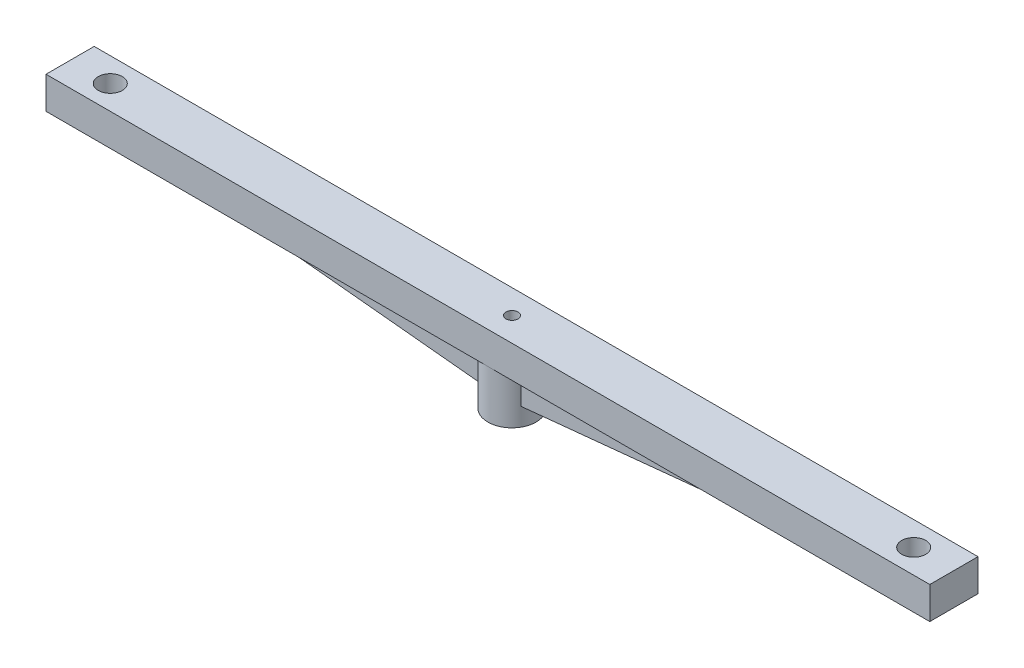
ISO-10303-21;
HEADER;
FILE_DESCRIPTION(('STEP AP214'),'2;1');
FILE_NAME('part.step','',(''),(''),'','','');
FILE_SCHEMA(('AUTOMOTIVE_DESIGN { 1 0 10303 214 1 1 1 1 }'));
ENDSEC;
DATA;
#1=APPLICATION_CONTEXT('core data for automotive mechanical design processes');
#2=APPLICATION_PROTOCOL_DEFINITION('international standard','automotive_design',2000,#1);
#3=PRODUCT_CONTEXT('',#1,'mechanical');
#4=PRODUCT('Part','Part','',(#3));
#5=PRODUCT_RELATED_PRODUCT_CATEGORY('part','',(#4));
#6=PRODUCT_DEFINITION_FORMATION('','',#4);
#7=PRODUCT_DEFINITION_CONTEXT('part definition',#1,'design');
#8=PRODUCT_DEFINITION('design','',#6,#7);
#9=PRODUCT_DEFINITION_SHAPE('','',#8);
#10=(LENGTH_UNIT() NAMED_UNIT(*) SI_UNIT(.MILLI.,.METRE.));
#11=(NAMED_UNIT(*) PLANE_ANGLE_UNIT() SI_UNIT($,.RADIAN.));
#12=(NAMED_UNIT(*) SI_UNIT($,.STERADIAN.) SOLID_ANGLE_UNIT());
#13=UNCERTAINTY_MEASURE_WITH_UNIT(LENGTH_MEASURE(1.E-05),#10,'distance_accuracy_value','');
#14=(GEOMETRIC_REPRESENTATION_CONTEXT(3) GLOBAL_UNCERTAINTY_ASSIGNED_CONTEXT((#13)) GLOBAL_UNIT_ASSIGNED_CONTEXT((#10,
#11,#12)) REPRESENTATION_CONTEXT('',''));
#15=CARTESIAN_POINT('',(0.,0.,0.));
#16=DIRECTION('',(0.,0.,1.));
#17=DIRECTION('',(1.,0.,0.));
#18=AXIS2_PLACEMENT_3D('',#15,#16,#17);
#19=CARTESIAN_POINT('',(55.,-1.99999999999999,3.));
#20=DIRECTION('',(0.,1.,0.));
#21=DIRECTION('',(-1.,0.,0.));
#22=AXIS2_PLACEMENT_3D('',#19,#20,#21);
#23=PLANE('',#22);
#24=CARTESIAN_POINT('',(0.,-2.,0.));
#25=DIRECTION('',(0.,-1.,0.));
#26=DIRECTION('',(1.,0.,0.));
#27=AXIS2_PLACEMENT_3D('',#24,#25,#26);
#28=CIRCLE('',#27,3.);
#29=CARTESIAN_POINT('',(-2.59807621135332,-2.,-1.5));
#30=VERTEX_POINT('',#29);
#31=CARTESIAN_POINT('',(0.,-2.,-3.));
#32=VERTEX_POINT('',#31);
#33=EDGE_CURVE('E138',#30,#32,#28,.T.);
#34=ORIENTED_EDGE('',*,*,#33,.F.);
#35=DIRECTION('',(-1.,0.,0.));
#36=VECTOR('',#35,1.);
#37=CARTESIAN_POINT('',(-40.,-2.00000000000001,-1.5));
#38=LINE('',#37,#36);
#39=CARTESIAN_POINT('',(-40.,-2.00000000000001,-1.5));
#40=VERTEX_POINT('',#39);
#41=EDGE_CURVE('E125',#30,#40,#38,.T.);
#42=ORIENTED_EDGE('',*,*,#41,.T.);
#43=DIRECTION('',(0.,0.,-1.));
#44=VECTOR('',#43,1.);
#45=CARTESIAN_POINT('',(-40.,-2.00000000000001,1.5));
#46=LINE('',#45,#44);
#47=CARTESIAN_POINT('',(-40.,-2.00000000000001,1.5));
#48=VERTEX_POINT('',#47);
#49=EDGE_CURVE('E174',#48,#40,#46,.T.);
#50=ORIENTED_EDGE('',*,*,#49,.F.);
#51=DIRECTION('',(-1.,0.,0.));
#52=VECTOR('',#51,1.);
#53=CARTESIAN_POINT('',(-40.,-2.00000000000001,1.5));
#54=LINE('',#53,#52);
#55=CARTESIAN_POINT('',(-2.59807621135331,-2.,1.5));
#56=VERTEX_POINT('',#55);
#57=EDGE_CURVE('E191',#56,#48,#54,.T.);
#58=ORIENTED_EDGE('',*,*,#57,.F.);
#59=CARTESIAN_POINT('',(0.,-2.,3.));
#60=VERTEX_POINT('',#59);
#61=EDGE_CURVE('E56',#60,#56,#28,.T.);
#62=ORIENTED_EDGE('',*,*,#61,.F.);
#63=DIRECTION('',(1.,0.,0.));
#64=VECTOR('',#63,1.);
#65=CARTESIAN_POINT('',(55.,-1.99999999999999,3.));
#66=LINE('',#65,#64);
#67=CARTESIAN_POINT('',(-55.,-2.00000000000001,3.));
#68=VERTEX_POINT('',#67);
#69=EDGE_CURVE('E178',#68,#60,#66,.T.);
#70=ORIENTED_EDGE('',*,*,#69,.F.);
#71=DIRECTION('',(0.,0.,-1.));
#72=VECTOR('',#71,1.);
#73=CARTESIAN_POINT('',(-55.,-2.00000000000001,3.));
#74=LINE('',#73,#72);
#75=CARTESIAN_POINT('',(-55.,-2.00000000000001,-3.));
#76=VERTEX_POINT('',#75);
#77=EDGE_CURVE('E150',#68,#76,#74,.T.);
#78=ORIENTED_EDGE('',*,*,#77,.T.);
#79=DIRECTION('',(1.,0.,0.));
#80=VECTOR('',#79,1.);
#81=CARTESIAN_POINT('',(55.,-1.99999999999999,-3.));
#82=LINE('',#81,#80);
#83=EDGE_CURVE('E141',#76,#32,#82,.T.);
#84=ORIENTED_EDGE('',*,*,#83,.T.);
#85=EDGE_LOOP('',(#34,#42,#50,#58,#62,#70,#78,#84));
#86=FACE_BOUND('',#85,.T.);
#87=CARTESIAN_POINT('',(-50.,-2.00000000000001,0.));
#88=DIRECTION('',(0.,1.,0.));
#89=DIRECTION('',(-1.,0.,0.));
#90=AXIS2_PLACEMENT_3D('',#87,#88,#89);
#91=CIRCLE('',#90,1.5);
#92=CARTESIAN_POINT('',(-51.5,-2.00000000000001,0.));
#93=VERTEX_POINT('',#92);
#94=EDGE_CURVE('E205',#93,#93,#91,.T.);
#95=ORIENTED_EDGE('',*,*,#94,.T.);
#96=EDGE_LOOP('',(#95));
#97=FACE_BOUND('',#96,.T.);
#98=ADVANCED_FACE('F40',(#86,#97),#23,.F.);
#99=CARTESIAN_POINT('',(0.,0.,1.5));
#100=DIRECTION('',(0.,0.,1.));
#101=DIRECTION('',(1.,0.,0.));
#102=AXIS2_PLACEMENT_3D('',#99,#100,#101);
#103=PLANE('',#102);
#104=CARTESIAN_POINT('',(40.,-2.,1.5));
#105=VERTEX_POINT('',#104);
#106=CARTESIAN_POINT('',(2.59807621135331,-2.,1.5));
#107=VERTEX_POINT('',#106);
#108=EDGE_CURVE('E197',#105,#107,#54,.T.);
#109=ORIENTED_EDGE('',*,*,#108,.T.);
#110=DIRECTION('',(0.,1.,0.));
#111=VECTOR('',#110,1.);
#112=CARTESIAN_POINT('',(2.59807621135332,-8.,1.5));
#113=LINE('',#112,#111);
#114=CARTESIAN_POINT('',(2.59807621135332,-5.74019237886467,1.5));
#115=VERTEX_POINT('',#114);
#116=EDGE_CURVE('E211',#107,#115,#113,.F.);
#117=ORIENTED_EDGE('',*,*,#116,.T.);
#118=DIRECTION('',(0.995037190209989,0.0995037190209991,0.));
#119=VECTOR('',#118,1.);
#120=CARTESIAN_POINT('',(0.,-6.,1.5));
#121=LINE('',#120,#119);
#122=EDGE_CURVE('E188',#115,#105,#121,.T.);
#123=ORIENTED_EDGE('',*,*,#122,.T.);
#124=EDGE_LOOP('',(#109,#117,#123));
#125=FACE_BOUND('',#124,.T.);
#126=ADVANCED_FACE('F253',(#125),#103,.T.);
#127=DIRECTION('',(0.995037190209989,-0.0995037190209988,0.));
#128=VECTOR('',#127,1.);
#129=CARTESIAN_POINT('',(-40.,-2.00000000000001,1.5));
#130=LINE('',#129,#128);
#131=CARTESIAN_POINT('',(-2.59807621135332,-5.74019237886467,1.5));
#132=VERTEX_POINT('',#131);
#133=EDGE_CURVE('E194',#48,#132,#130,.T.);
#134=ORIENTED_EDGE('',*,*,#133,.T.);
#135=DIRECTION('',(0.,1.,0.));
#136=VECTOR('',#135,1.);
#137=CARTESIAN_POINT('',(-2.59807621135332,-8.,1.5));
#138=LINE('',#137,#136);
#139=EDGE_CURVE('E216',#132,#56,#138,.T.);
#140=ORIENTED_EDGE('',*,*,#139,.T.);
#141=ORIENTED_EDGE('',*,*,#57,.T.);
#142=EDGE_LOOP('',(#134,#140,#141));
#143=FACE_BOUND('',#142,.T.);
#144=ADVANCED_FACE('F258',(#143),#103,.T.);
#145=CARTESIAN_POINT('',(0.,0.,-1.5));
#146=DIRECTION('',(0.,0.,1.));
#147=DIRECTION('',(1.,0.,0.));
#148=AXIS2_PLACEMENT_3D('',#145,#146,#147);
#149=PLANE('',#148);
#150=DIRECTION('',(0.,1.,0.));
#151=VECTOR('',#150,1.);
#152=CARTESIAN_POINT('',(2.59807621135332,-8.,-1.5));
#153=LINE('',#152,#151);
#154=CARTESIAN_POINT('',(2.59807621135331,-2.,-1.5));
#155=VERTEX_POINT('',#154);
#156=CARTESIAN_POINT('',(2.59807621135332,-5.74019237886467,-1.5));
#157=VERTEX_POINT('',#156);
#158=EDGE_CURVE('E11',#155,#157,#153,.F.);
#159=ORIENTED_EDGE('',*,*,#158,.F.);
#160=CARTESIAN_POINT('',(40.,-2.,-1.5));
#161=VERTEX_POINT('',#160);
#162=EDGE_CURVE('E133',#161,#155,#38,.T.);
#163=ORIENTED_EDGE('',*,*,#162,.F.);
#164=DIRECTION('',(0.995037190209989,0.0995037190209991,0.));
#165=VECTOR('',#164,1.);
#166=CARTESIAN_POINT('',(0.,-6.,-1.5));
#167=LINE('',#166,#165);
#168=EDGE_CURVE('E189',#157,#161,#167,.T.);
#169=ORIENTED_EDGE('',*,*,#168,.F.);
#170=EDGE_LOOP('',(#159,#163,#169));
#171=FACE_BOUND('',#170,.T.);
#172=ADVANCED_FACE('F305',(#171),#149,.F.);
#173=DIRECTION('',(0.,1.,0.));
#174=VECTOR('',#173,1.);
#175=CARTESIAN_POINT('',(-2.59807621135332,-8.,-1.5));
#176=LINE('',#175,#174);
#177=CARTESIAN_POINT('',(-2.59807621135332,-5.74019237886467,-1.5));
#178=VERTEX_POINT('',#177);
#179=EDGE_CURVE('E49',#178,#30,#176,.T.);
#180=ORIENTED_EDGE('',*,*,#179,.F.);
#181=DIRECTION('',(0.995037190209989,-0.0995037190209988,0.));
#182=VECTOR('',#181,1.);
#183=CARTESIAN_POINT('',(-40.,-2.00000000000001,-1.5));
#184=LINE('',#183,#182);
#185=EDGE_CURVE('E130',#40,#178,#184,.T.);
#186=ORIENTED_EDGE('',*,*,#185,.F.);
#187=ORIENTED_EDGE('',*,*,#41,.F.);
#188=EDGE_LOOP('',(#180,#186,#187));
#189=FACE_BOUND('',#188,.T.);
#190=ADVANCED_FACE('F127',(#189),#149,.F.);
#191=CARTESIAN_POINT('',(-55.,-2.00000000000001,3.));
#192=DIRECTION('',(1.,0.,0.));
#193=DIRECTION('',(0.,0.,-1.));
#194=AXIS2_PLACEMENT_3D('',#191,#192,#193);
#195=PLANE('',#194);
#196=DIRECTION('',(0.,-1.,0.));
#197=VECTOR('',#196,1.);
#198=CARTESIAN_POINT('',(-55.,-2.00000000000001,-3.));
#199=LINE('',#198,#197);
#200=CARTESIAN_POINT('',(-55.,1.99999999999999,-3.));
#201=VERTEX_POINT('',#200);
#202=EDGE_CURVE('E171',#201,#76,#199,.T.);
#203=ORIENTED_EDGE('',*,*,#202,.T.);
#204=ORIENTED_EDGE('',*,*,#77,.F.);
#205=DIRECTION('',(0.,-1.,0.));
#206=VECTOR('',#205,1.);
#207=CARTESIAN_POINT('',(-55.,-2.00000000000001,3.));
#208=LINE('',#207,#206);
#209=CARTESIAN_POINT('',(-55.,1.99999999999999,3.));
#210=VERTEX_POINT('',#209);
#211=EDGE_CURVE('E166',#210,#68,#208,.T.);
#212=ORIENTED_EDGE('',*,*,#211,.F.);
#213=DIRECTION('',(0.,0.,-1.));
#214=VECTOR('',#213,1.);
#215=CARTESIAN_POINT('',(-55.,1.99999999999999,3.));
#216=LINE('',#215,#214);
#217=EDGE_CURVE('E160',#210,#201,#216,.T.);
#218=ORIENTED_EDGE('',*,*,#217,.T.);
#219=EDGE_LOOP('',(#203,#204,#212,#218));
#220=FACE_BOUND('',#219,.T.);
#221=ADVANCED_FACE('F42',(#220),#195,.F.);
#222=EDGE_CURVE('E64',#32,#155,#28,.T.);
#223=ORIENTED_EDGE('',*,*,#222,.F.);
#224=CARTESIAN_POINT('',(55.,-1.99999999999999,-3.));
#225=VERTEX_POINT('',#224);
#226=EDGE_CURVE('E170',#32,#225,#82,.T.);
#227=ORIENTED_EDGE('',*,*,#226,.T.);
#228=DIRECTION('',(0.,0.,-1.));
#229=VECTOR('',#228,1.);
#230=CARTESIAN_POINT('',(55.,-1.99999999999999,3.));
#231=LINE('',#230,#229);
#232=CARTESIAN_POINT('',(55.,-1.99999999999999,3.));
#233=VERTEX_POINT('',#232);
#234=EDGE_CURVE('E152',#233,#225,#231,.T.);
#235=ORIENTED_EDGE('',*,*,#234,.F.);
#236=EDGE_CURVE('E181',#60,#233,#66,.T.);
#237=ORIENTED_EDGE('',*,*,#236,.F.);
#238=EDGE_CURVE('E219',#107,#60,#28,.T.);
#239=ORIENTED_EDGE('',*,*,#238,.F.);
#240=ORIENTED_EDGE('',*,*,#108,.F.);
#241=DIRECTION('',(0.,0.,-1.));
#242=VECTOR('',#241,1.);
#243=CARTESIAN_POINT('',(40.,-2.,1.5));
#244=LINE('',#243,#242);
#245=EDGE_CURVE('E185',#105,#161,#244,.T.);
#246=ORIENTED_EDGE('',*,*,#245,.T.);
#247=ORIENTED_EDGE('',*,*,#162,.T.);
#248=EDGE_LOOP('',(#223,#227,#235,#237,#239,#240,#246,#247));
#249=FACE_BOUND('',#248,.T.);
#250=CARTESIAN_POINT('',(50.,-1.99999999999999,0.));
#251=DIRECTION('',(0.,1.,0.));
#252=DIRECTION('',(-1.,0.,0.));
#253=AXIS2_PLACEMENT_3D('',#250,#251,#252);
#254=CIRCLE('',#253,1.5);
#255=CARTESIAN_POINT('',(48.5,-1.99999999999999,0.));
#256=VERTEX_POINT('',#255);
#257=EDGE_CURVE('E134',#256,#256,#254,.T.);
#258=ORIENTED_EDGE('',*,*,#257,.T.);
#259=EDGE_LOOP('',(#258));
#260=FACE_BOUND('',#259,.T.);
#261=ADVANCED_FACE('F254',(#249,#260),#23,.F.);
#262=CARTESIAN_POINT('',(55.,-1.99999999999999,3.));
#263=DIRECTION('',(-1.,0.,0.));
#264=DIRECTION('',(0.,0.,1.));
#265=AXIS2_PLACEMENT_3D('',#262,#263,#264);
#266=PLANE('',#265);
#267=DIRECTION('',(0.,1.,0.));
#268=VECTOR('',#267,1.);
#269=CARTESIAN_POINT('',(55.,-1.99999999999999,-3.));
#270=LINE('',#269,#268);
#271=CARTESIAN_POINT('',(55.,2.00000000000001,-3.));
#272=VERTEX_POINT('',#271);
#273=EDGE_CURVE('E167',#225,#272,#270,.T.);
#274=ORIENTED_EDGE('',*,*,#273,.T.);
#275=DIRECTION('',(0.,0.,-1.));
#276=VECTOR('',#275,1.);
#277=CARTESIAN_POINT('',(55.,2.00000000000001,3.));
#278=LINE('',#277,#276);
#279=CARTESIAN_POINT('',(55.,2.00000000000001,3.));
#280=VERTEX_POINT('',#279);
#281=EDGE_CURVE('E157',#280,#272,#278,.T.);
#282=ORIENTED_EDGE('',*,*,#281,.F.);
#283=DIRECTION('',(0.,1.,0.));
#284=VECTOR('',#283,1.);
#285=CARTESIAN_POINT('',(55.,-1.99999999999999,3.));
#286=LINE('',#285,#284);
#287=EDGE_CURVE('E176',#233,#280,#286,.T.);
#288=ORIENTED_EDGE('',*,*,#287,.F.);
#289=ORIENTED_EDGE('',*,*,#234,.T.);
#290=EDGE_LOOP('',(#274,#282,#288,#289));
#291=FACE_BOUND('',#290,.T.);
#292=ADVANCED_FACE('F263',(#291),#266,.F.);
#293=CARTESIAN_POINT('',(55.,2.00000000000001,3.));
#294=DIRECTION('',(0.,-1.,0.));
#295=DIRECTION('',(1.,0.,0.));
#296=AXIS2_PLACEMENT_3D('',#293,#294,#295);
#297=PLANE('',#296);
#298=CARTESIAN_POINT('',(0.,2.,0.));
#299=DIRECTION('',(0.,-1.,0.));
#300=DIRECTION('',(1.,0.,0.));
#301=AXIS2_PLACEMENT_3D('',#298,#299,#300);
#302=CIRCLE('',#301,0.749999999999998);
#303=CARTESIAN_POINT('',(0.749999999999999,2.,0.));
#304=VERTEX_POINT('',#303);
#305=EDGE_CURVE('E224',#304,#304,#302,.T.);
#306=ORIENTED_EDGE('',*,*,#305,.T.);
#307=EDGE_LOOP('',(#306));
#308=FACE_BOUND('',#307,.T.);
#309=CARTESIAN_POINT('',(-50.,1.99999999999999,0.));
#310=DIRECTION('',(0.,1.,0.));
#311=DIRECTION('',(0.,0.,1.));
#312=AXIS2_PLACEMENT_3D('',#309,#310,#311);
#313=CIRCLE('',#312,1.5);
#314=CARTESIAN_POINT('',(-50.,1.99999999999999,1.5));
#315=VERTEX_POINT('',#314);
#316=EDGE_CURVE('E208',#315,#315,#313,.T.);
#317=ORIENTED_EDGE('',*,*,#316,.F.);
#318=EDGE_LOOP('',(#317));
#319=FACE_BOUND('',#318,.T.);
#320=CARTESIAN_POINT('',(50.,2.00000000000001,0.));
#321=DIRECTION('',(0.,1.,0.));
#322=DIRECTION('',(0.,0.,1.));
#323=AXIS2_PLACEMENT_3D('',#320,#321,#322);
#324=CIRCLE('',#323,1.5);
#325=CARTESIAN_POINT('',(50.,2.00000000000001,1.5));
#326=VERTEX_POINT('',#325);
#327=EDGE_CURVE('E202',#326,#326,#324,.T.);
#328=ORIENTED_EDGE('',*,*,#327,.F.);
#329=EDGE_LOOP('',(#328));
#330=FACE_BOUND('',#329,.T.);
#331=DIRECTION('',(-1.,0.,0.));
#332=VECTOR('',#331,1.);
#333=CARTESIAN_POINT('',(55.,2.00000000000001,-3.));
#334=LINE('',#333,#332);
#335=EDGE_CURVE('E164',#272,#201,#334,.T.);
#336=ORIENTED_EDGE('',*,*,#335,.T.);
#337=ORIENTED_EDGE('',*,*,#217,.F.);
#338=DIRECTION('',(-1.,0.,0.));
#339=VECTOR('',#338,1.);
#340=CARTESIAN_POINT('',(55.,2.00000000000001,3.));
#341=LINE('',#340,#339);
#342=EDGE_CURVE('E163',#280,#210,#341,.T.);
#343=ORIENTED_EDGE('',*,*,#342,.F.);
#344=ORIENTED_EDGE('',*,*,#281,.T.);
#345=EDGE_LOOP('',(#336,#337,#343,#344));
#346=FACE_BOUND('',#345,.T.);
#347=ADVANCED_FACE('F268',(#308,#319,#330,#346),#297,.F.);
#348=CARTESIAN_POINT('',(0.,0.,3.));
#349=DIRECTION('',(0.,0.,1.));
#350=DIRECTION('',(1.,0.,0.));
#351=AXIS2_PLACEMENT_3D('',#348,#349,#350);
#352=PLANE('',#351);
#353=ORIENTED_EDGE('',*,*,#211,.T.);
#354=ORIENTED_EDGE('',*,*,#69,.T.);
#355=ORIENTED_EDGE('',*,*,#236,.T.);
#356=ORIENTED_EDGE('',*,*,#287,.T.);
#357=ORIENTED_EDGE('',*,*,#342,.T.);
#358=EDGE_LOOP('',(#353,#354,#355,#356,#357));
#359=FACE_BOUND('',#358,.T.);
#360=ADVANCED_FACE('F282',(#359),#352,.T.);
#361=CARTESIAN_POINT('',(0.,0.,-3.));
#362=DIRECTION('',(0.,0.,1.));
#363=DIRECTION('',(1.,0.,0.));
#364=AXIS2_PLACEMENT_3D('',#361,#362,#363);
#365=PLANE('',#364);
#366=ORIENTED_EDGE('',*,*,#202,.F.);
#367=ORIENTED_EDGE('',*,*,#335,.F.);
#368=ORIENTED_EDGE('',*,*,#273,.F.);
#369=ORIENTED_EDGE('',*,*,#226,.F.);
#370=ORIENTED_EDGE('',*,*,#83,.F.);
#371=EDGE_LOOP('',(#366,#367,#368,#369,#370));
#372=FACE_BOUND('',#371,.T.);
#373=ADVANCED_FACE('F294',(#372),#365,.F.);
#374=CARTESIAN_POINT('',(-40.,-2.00000000000001,1.5));
#375=DIRECTION('',(0.0995037190209989,0.995037190209989,0.));
#376=DIRECTION('',(-0.995037190209989,0.0995037190209989,0.));
#377=AXIS2_PLACEMENT_3D('',#374,#375,#376);
#378=PLANE('',#377);
#379=CARTESIAN_POINT('',(0.,-6.,0.));
#380=DIRECTION('',(0.0995037190209989,0.995037190209989,0.));
#381=DIRECTION('',(-0.995037190209989,0.0995037190209989,0.));
#382=AXIS2_PLACEMENT_3D('',#379,#380,#381);
#383=ELLIPSE('',#382,3.01496268633627,3.);
#384=EDGE_CURVE('E149',#132,#178,#383,.F.);
#385=ORIENTED_EDGE('',*,*,#384,.F.);
#386=ORIENTED_EDGE('',*,*,#133,.F.);
#387=ORIENTED_EDGE('',*,*,#49,.T.);
#388=ORIENTED_EDGE('',*,*,#185,.T.);
#389=EDGE_LOOP('',(#385,#386,#387,#388));
#390=FACE_BOUND('',#389,.T.);
#391=ADVANCED_FACE('F316',(#390),#378,.F.);
#392=CARTESIAN_POINT('',(0.,-6.,1.5));
#393=DIRECTION('',(-0.0995037190209991,0.995037190209989,0.));
#394=DIRECTION('',(-0.995037190209989,-0.0995037190209991,0.));
#395=AXIS2_PLACEMENT_3D('',#392,#393,#394);
#396=PLANE('',#395);
#397=CARTESIAN_POINT('',(0.,-6.,0.));
#398=DIRECTION('',(-0.0995037190209991,0.995037190209989,0.));
#399=DIRECTION('',(0.995037190209989,0.0995037190209991,0.));
#400=AXIS2_PLACEMENT_3D('',#397,#398,#399);
#401=ELLIPSE('',#400,3.01496268633627,3.);
#402=EDGE_CURVE('E213',#157,#115,#401,.F.);
#403=ORIENTED_EDGE('',*,*,#402,.F.);
#404=ORIENTED_EDGE('',*,*,#168,.T.);
#405=ORIENTED_EDGE('',*,*,#245,.F.);
#406=ORIENTED_EDGE('',*,*,#122,.F.);
#407=EDGE_LOOP('',(#403,#404,#405,#406));
#408=FACE_BOUND('',#407,.T.);
#409=ADVANCED_FACE('F276',(#408),#396,.F.);
#410=CARTESIAN_POINT('',(50.,2.00000000000001,0.));
#411=DIRECTION('',(0.,1.,0.));
#412=DIRECTION('',(0.,0.,1.));
#413=AXIS2_PLACEMENT_3D('',#410,#411,#412);
#414=CYLINDRICAL_SURFACE('',#413,1.5);
#415=ORIENTED_EDGE('',*,*,#257,.F.);
#416=EDGE_LOOP('',(#415));
#417=FACE_BOUND('',#416,.T.);
#418=ORIENTED_EDGE('',*,*,#327,.T.);
#419=EDGE_LOOP('',(#418));
#420=FACE_BOUND('',#419,.T.);
#421=ADVANCED_FACE('F249',(#417,#420),#414,.F.);
#422=CARTESIAN_POINT('',(-50.,1.99999999999999,0.));
#423=DIRECTION('',(0.,1.,0.));
#424=DIRECTION('',(0.,0.,1.));
#425=AXIS2_PLACEMENT_3D('',#422,#423,#424);
#426=CYLINDRICAL_SURFACE('',#425,1.5);
#427=ORIENTED_EDGE('',*,*,#94,.F.);
#428=EDGE_LOOP('',(#427));
#429=FACE_BOUND('',#428,.T.);
#430=ORIENTED_EDGE('',*,*,#316,.T.);
#431=EDGE_LOOP('',(#430));
#432=FACE_BOUND('',#431,.T.);
#433=ADVANCED_FACE('F244',(#429,#432),#426,.F.);
#434=CARTESIAN_POINT('',(0.,-8.,0.));
#435=DIRECTION('',(0.,1.,0.));
#436=DIRECTION('',(-1.,0.,0.));
#437=AXIS2_PLACEMENT_3D('',#434,#435,#436);
#438=CYLINDRICAL_SURFACE('',#437,3.);
#439=ORIENTED_EDGE('',*,*,#116,.F.);
#440=ORIENTED_EDGE('',*,*,#238,.T.);
#441=ORIENTED_EDGE('',*,*,#61,.T.);
#442=ORIENTED_EDGE('',*,*,#139,.F.);
#443=ORIENTED_EDGE('',*,*,#384,.T.);
#444=ORIENTED_EDGE('',*,*,#179,.T.);
#445=ORIENTED_EDGE('',*,*,#33,.T.);
#446=ORIENTED_EDGE('',*,*,#222,.T.);
#447=ORIENTED_EDGE('',*,*,#158,.T.);
#448=ORIENTED_EDGE('',*,*,#402,.T.);
#449=EDGE_LOOP('',(#439,#440,#441,#442,#443,#444,#445,#446,#447,#448));
#450=FACE_BOUND('',#449,.T.);
#451=CARTESIAN_POINT('',(0.,-8.,0.));
#452=DIRECTION('',(0.,-1.,0.));
#453=DIRECTION('',(1.,0.,0.));
#454=AXIS2_PLACEMENT_3D('',#451,#452,#453);
#455=CIRCLE('',#454,3.);
#456=CARTESIAN_POINT('',(3.,-8.,0.));
#457=VERTEX_POINT('',#456);
#458=EDGE_CURVE('E218',#457,#457,#455,.T.);
#459=ORIENTED_EDGE('',*,*,#458,.F.);
#460=EDGE_LOOP('',(#459));
#461=FACE_BOUND('',#460,.T.);
#462=ADVANCED_FACE('F146',(#450,#461),#438,.T.);
#463=CARTESIAN_POINT('',(0.,-8.,0.));
#464=DIRECTION('',(0.,-1.,0.));
#465=DIRECTION('',(1.,0.,0.));
#466=AXIS2_PLACEMENT_3D('',#463,#464,#465);
#467=PLANE('',#466);
#468=CARTESIAN_POINT('',(0.,-8.,0.));
#469=DIRECTION('',(0.,-1.,0.));
#470=DIRECTION('',(1.,0.,0.));
#471=AXIS2_PLACEMENT_3D('',#468,#469,#470);
#472=CIRCLE('',#471,2.);
#473=CARTESIAN_POINT('',(2.,-8.,0.));
#474=VERTEX_POINT('',#473);
#475=EDGE_CURVE('E230',#474,#474,#472,.T.);
#476=ORIENTED_EDGE('',*,*,#475,.F.);
#477=EDGE_LOOP('',(#476));
#478=FACE_BOUND('',#477,.T.);
#479=ORIENTED_EDGE('',*,*,#458,.T.);
#480=EDGE_LOOP('',(#479));
#481=FACE_BOUND('',#480,.T.);
#482=ADVANCED_FACE('F237',(#478,#481),#467,.T.);
#483=CARTESIAN_POINT('',(0.,-8.,0.));
#484=DIRECTION('',(0.,-1.,0.));
#485=DIRECTION('',(0.,0.,-1.));
#486=AXIS2_PLACEMENT_3D('',#483,#484,#485);
#487=CYLINDRICAL_SURFACE('',#486,0.749999999999998);
#488=CARTESIAN_POINT('',(0.,-2.,0.));
#489=DIRECTION('',(0.,1.,0.));
#490=DIRECTION('',(-1.,0.,0.));
#491=AXIS2_PLACEMENT_3D('',#488,#489,#490);
#492=CIRCLE('',#491,0.749999999999998);
#493=CARTESIAN_POINT('',(-0.749999999999998,-2.,0.));
#494=VERTEX_POINT('',#493);
#495=EDGE_CURVE('E44',#494,#494,#492,.F.);
#496=ORIENTED_EDGE('',*,*,#495,.T.);
#497=EDGE_LOOP('',(#496));
#498=FACE_BOUND('',#497,.T.);
#499=ORIENTED_EDGE('',*,*,#305,.F.);
#500=EDGE_LOOP('',(#499));
#501=FACE_BOUND('',#500,.T.);
#502=ADVANCED_FACE('F240',(#498,#501),#487,.F.);
#503=CARTESIAN_POINT('',(55.,-1.99999999999999,3.));
#504=DIRECTION('',(0.,1.,0.));
#505=DIRECTION('',(-1.,0.,0.));
#506=AXIS2_PLACEMENT_3D('',#503,#504,#505);
#507=PLANE('',#506);
#508=CARTESIAN_POINT('',(0.,-2.,0.));
#509=DIRECTION('',(0.,1.,0.));
#510=DIRECTION('',(-1.,0.,0.));
#511=AXIS2_PLACEMENT_3D('',#508,#509,#510);
#512=CIRCLE('',#511,2.);
#513=CARTESIAN_POINT('',(-2.,-2.,0.));
#514=VERTEX_POINT('',#513);
#515=EDGE_CURVE('E227',#514,#514,#512,.F.);
#516=ORIENTED_EDGE('',*,*,#515,.T.);
#517=EDGE_LOOP('',(#516));
#518=FACE_BOUND('',#517,.T.);
#519=ORIENTED_EDGE('',*,*,#495,.F.);
#520=EDGE_LOOP('',(#519));
#521=FACE_BOUND('',#520,.T.);
#522=ADVANCED_FACE('F420',(#518,#521),#507,.F.);
#523=CARTESIAN_POINT('',(0.,3.65685424949238,0.));
#524=DIRECTION('',(0.,-1.,0.));
#525=DIRECTION('',(1.,0.,0.));
#526=AXIS2_PLACEMENT_3D('',#523,#524,#525);
#527=CYLINDRICAL_SURFACE('',#526,2.);
#528=ORIENTED_EDGE('',*,*,#475,.T.);
#529=EDGE_LOOP('',(#528));
#530=FACE_BOUND('',#529,.T.);
#531=ORIENTED_EDGE('',*,*,#515,.F.);
#532=EDGE_LOOP('',(#531));
#533=FACE_BOUND('',#532,.T.);
#534=ADVANCED_FACE('F234',(#530,#533),#527,.F.);
#535=CLOSED_SHELL('',(#98,#126,#144,#172,#190,#221,#261,#292,#347,#360,#373,#391,#409,#421,#433,
#462,#482,#502,#522,#534));
#536=MANIFOLD_SOLID_BREP('B2',#535);
#537=ADVANCED_BREP_SHAPE_REPRESENTATION('',(#18,#536),#14);
#538=SHAPE_DEFINITION_REPRESENTATION(#9,#537);
ENDSEC;
END-ISO-10303-21;
